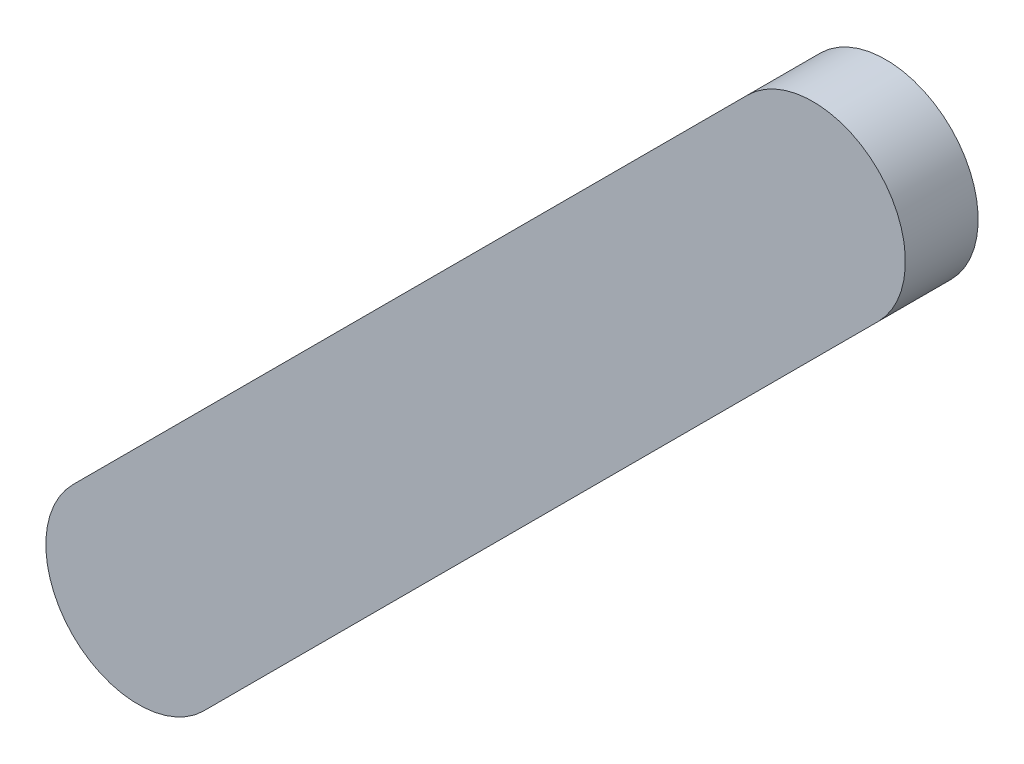
ISO-10303-21;
HEADER;
FILE_DESCRIPTION(('STEP AP214'),'2;1');
FILE_NAME('part.step','',(''),(''),'','','');
FILE_SCHEMA(('AUTOMOTIVE_DESIGN { 1 0 10303 214 1 1 1 1 }'));
ENDSEC;
DATA;
#1=APPLICATION_CONTEXT('core data for automotive mechanical design processes');
#2=APPLICATION_PROTOCOL_DEFINITION('international standard','automotive_design',2000,#1);
#3=PRODUCT_CONTEXT('',#1,'mechanical');
#4=PRODUCT('Part','Part','',(#3));
#5=PRODUCT_RELATED_PRODUCT_CATEGORY('part','',(#4));
#6=PRODUCT_DEFINITION_FORMATION('','',#4);
#7=PRODUCT_DEFINITION_CONTEXT('part definition',#1,'design');
#8=PRODUCT_DEFINITION('design','',#6,#7);
#9=PRODUCT_DEFINITION_SHAPE('','',#8);
#10=(LENGTH_UNIT() NAMED_UNIT(*) SI_UNIT(.MILLI.,.METRE.));
#11=(NAMED_UNIT(*) PLANE_ANGLE_UNIT() SI_UNIT($,.RADIAN.));
#12=(NAMED_UNIT(*) SI_UNIT($,.STERADIAN.) SOLID_ANGLE_UNIT());
#13=UNCERTAINTY_MEASURE_WITH_UNIT(LENGTH_MEASURE(1.E-05),#10,'distance_accuracy_value','');
#14=(GEOMETRIC_REPRESENTATION_CONTEXT(3) GLOBAL_UNCERTAINTY_ASSIGNED_CONTEXT((#13)) GLOBAL_UNIT_ASSIGNED_CONTEXT((#10,
#11,#12)) REPRESENTATION_CONTEXT('',''));
#15=CARTESIAN_POINT('',(0.,0.,0.));
#16=DIRECTION('',(0.,0.,1.));
#17=DIRECTION('',(1.,0.,0.));
#18=AXIS2_PLACEMENT_3D('',#15,#16,#17);
#19=CARTESIAN_POINT('',(107.74860594,119.12419406,0.));
#20=DIRECTION('',(-0.707106781186548,0.707106781186548,0.));
#21=DIRECTION('',(0.707106781186548,0.707106781186548,0.));
#22=AXIS2_PLACEMENT_3D('',#19,#20,#21);
#23=PLANE('',#22);
#24=DIRECTION('',(0.707106781186548,0.707106781186548,0.));
#25=VECTOR('',#24,1.);
#26=CARTESIAN_POINT('',(107.74860594,119.12419406,0.1999996));
#27=LINE('',#26,#25);
#28=CARTESIAN_POINT('',(107.74860594,119.12419406,0.1999996));
#29=VERTEX_POINT('',#28);
#30=CARTESIAN_POINT('',(109.60280594,120.97839406,0.1999996));
#31=VERTEX_POINT('',#30);
#32=EDGE_CURVE('E11',#29,#31,#27,.T.);
#33=ORIENTED_EDGE('',*,*,#32,.F.);
#34=DIRECTION('',(0.,0.,1.));
#35=VECTOR('',#34,1.);
#36=CARTESIAN_POINT('',(107.74860594,119.12419406,0.));
#37=LINE('',#36,#35);
#38=CARTESIAN_POINT('',(107.74860594,119.12419406,0.));
#39=VERTEX_POINT('',#38);
#40=EDGE_CURVE('E24',#39,#29,#37,.T.);
#41=ORIENTED_EDGE('',*,*,#40,.F.);
#42=DIRECTION('',(0.707106781186548,0.707106781186548,0.));
#43=VECTOR('',#42,1.);
#44=CARTESIAN_POINT('',(107.74860594,119.12419406,0.));
#45=LINE('',#44,#43);
#46=CARTESIAN_POINT('',(109.60280594,120.97839406,0.));
#47=VERTEX_POINT('',#46);
#48=EDGE_CURVE('E75',#39,#47,#45,.T.);
#49=ORIENTED_EDGE('',*,*,#48,.T.);
#50=DIRECTION('',(0.,0.,1.));
#51=VECTOR('',#50,1.);
#52=CARTESIAN_POINT('',(109.60280594,120.97839406,0.));
#53=LINE('',#52,#51);
#54=EDGE_CURVE('E37',#47,#31,#53,.T.);
#55=ORIENTED_EDGE('',*,*,#54,.T.);
#56=EDGE_LOOP('',(#33,#41,#49,#55));
#57=FACE_BOUND('',#56,.T.);
#58=ADVANCED_FACE('F17',(#57),#23,.F.);
#59=CARTESIAN_POINT('',(109.4232,121.158,0.));
#60=DIRECTION('',(0.,0.,-1.));
#61=DIRECTION('',(0.707106781186548,-0.707106781186548,0.));
#62=AXIS2_PLACEMENT_3D('',#59,#60,#61);
#63=CYLINDRICAL_SURFACE('',#62,0.254001156230771);
#64=CARTESIAN_POINT('',(109.4232,121.158,0.1999996));
#65=DIRECTION('',(0.,0.,1.));
#66=DIRECTION('',(0.707106781186548,-0.707106781186548,0.));
#67=AXIS2_PLACEMENT_3D('',#64,#65,#66);
#68=CIRCLE('',#67,0.254001156230771);
#69=CARTESIAN_POINT('',(109.24359406,121.33760594,0.1999996));
#70=VERTEX_POINT('',#69);
#71=EDGE_CURVE('E83',#31,#70,#68,.T.);
#72=ORIENTED_EDGE('',*,*,#71,.F.);
#73=ORIENTED_EDGE('',*,*,#54,.F.);
#74=CARTESIAN_POINT('',(109.4232,121.158,0.));
#75=DIRECTION('',(0.,0.,1.));
#76=DIRECTION('',(0.707106781186548,-0.707106781186548,0.));
#77=AXIS2_PLACEMENT_3D('',#74,#75,#76);
#78=CIRCLE('',#77,0.254001156230771);
#79=CARTESIAN_POINT('',(109.24359406,121.33760594,0.));
#80=VERTEX_POINT('',#79);
#81=EDGE_CURVE('E81',#47,#80,#78,.T.);
#82=ORIENTED_EDGE('',*,*,#81,.T.);
#83=DIRECTION('',(0.,0.,1.));
#84=VECTOR('',#83,1.);
#85=CARTESIAN_POINT('',(109.24359406,121.33760594,0.));
#86=LINE('',#85,#84);
#87=EDGE_CURVE('E67',#80,#70,#86,.T.);
#88=ORIENTED_EDGE('',*,*,#87,.T.);
#89=EDGE_LOOP('',(#72,#73,#82,#88));
#90=FACE_BOUND('',#89,.T.);
#91=ADVANCED_FACE('F89',(#90),#63,.T.);
#92=CARTESIAN_POINT('',(109.24359406,121.33760594,0.));
#93=DIRECTION('',(0.707106781186545,-0.70710678118655,0.));
#94=DIRECTION('',(-0.70710678118655,-0.707106781186545,0.));
#95=AXIS2_PLACEMENT_3D('',#92,#93,#94);
#96=PLANE('',#95);
#97=DIRECTION('',(-0.70710678118655,-0.707106781186545,0.));
#98=VECTOR('',#97,1.);
#99=CARTESIAN_POINT('',(109.24359406,121.33760594,0.1999996));
#100=LINE('',#99,#98);
#101=CARTESIAN_POINT('',(107.38939406,119.48340594,0.1999996));
#102=VERTEX_POINT('',#101);
#103=EDGE_CURVE('E71',#70,#102,#100,.T.);
#104=ORIENTED_EDGE('',*,*,#103,.F.);
#105=ORIENTED_EDGE('',*,*,#87,.F.);
#106=DIRECTION('',(-0.70710678118655,-0.707106781186545,0.));
#107=VECTOR('',#106,1.);
#108=CARTESIAN_POINT('',(109.24359406,121.33760594,0.));
#109=LINE('',#108,#107);
#110=CARTESIAN_POINT('',(107.38939406,119.48340594,0.));
#111=VERTEX_POINT('',#110);
#112=EDGE_CURVE('E63',#80,#111,#109,.T.);
#113=ORIENTED_EDGE('',*,*,#112,.T.);
#114=DIRECTION('',(0.,0.,1.));
#115=VECTOR('',#114,1.);
#116=CARTESIAN_POINT('',(107.38939406,119.48340594,0.));
#117=LINE('',#116,#115);
#118=EDGE_CURVE('E53',#111,#102,#117,.T.);
#119=ORIENTED_EDGE('',*,*,#118,.T.);
#120=EDGE_LOOP('',(#104,#105,#113,#119));
#121=FACE_BOUND('',#120,.T.);
#122=ADVANCED_FACE('F66',(#121),#96,.F.);
#123=CARTESIAN_POINT('',(107.569,119.3038,0.));
#124=DIRECTION('',(0.,0.,-1.));
#125=DIRECTION('',(-0.707106781186548,0.707106781186548,0.));
#126=AXIS2_PLACEMENT_3D('',#123,#124,#125);
#127=CYLINDRICAL_SURFACE('',#126,0.254001156230778);
#128=CARTESIAN_POINT('',(107.569,119.3038,0.1999996));
#129=DIRECTION('',(0.,0.,1.));
#130=DIRECTION('',(-0.707106781186548,0.707106781186548,0.));
#131=AXIS2_PLACEMENT_3D('',#128,#129,#130);
#132=CIRCLE('',#131,0.254001156230778);
#133=EDGE_CURVE('E59',#102,#29,#132,.T.);
#134=ORIENTED_EDGE('',*,*,#133,.F.);
#135=ORIENTED_EDGE('',*,*,#118,.F.);
#136=CARTESIAN_POINT('',(107.569,119.3038,0.));
#137=DIRECTION('',(0.,0.,1.));
#138=DIRECTION('',(-0.707106781186548,0.707106781186548,0.));
#139=AXIS2_PLACEMENT_3D('',#136,#137,#138);
#140=CIRCLE('',#139,0.254001156230778);
#141=EDGE_CURVE('E57',#111,#39,#140,.T.);
#142=ORIENTED_EDGE('',*,*,#141,.T.);
#143=ORIENTED_EDGE('',*,*,#40,.T.);
#144=EDGE_LOOP('',(#134,#135,#142,#143));
#145=FACE_BOUND('',#144,.T.);
#146=ADVANCED_FACE('F55',(#145),#127,.T.);
#147=CARTESIAN_POINT('',(107.74860594,119.12419406,0.));
#148=DIRECTION('',(0.,0.,-1.));
#149=DIRECTION('',(-1.,0.,0.));
#150=AXIS2_PLACEMENT_3D('',#147,#148,#149);
#151=PLANE('',#150);
#152=ORIENTED_EDGE('',*,*,#141,.F.);
#153=ORIENTED_EDGE('',*,*,#112,.F.);
#154=ORIENTED_EDGE('',*,*,#81,.F.);
#155=ORIENTED_EDGE('',*,*,#48,.F.);
#156=EDGE_LOOP('',(#152,#153,#154,#155));
#157=FACE_BOUND('',#156,.T.);
#158=ADVANCED_FACE('F74',(#157),#151,.T.);
#159=CARTESIAN_POINT('',(107.74860594,119.12419406,0.1999996));
#160=DIRECTION('',(0.,0.,-1.));
#161=DIRECTION('',(-1.,0.,0.));
#162=AXIS2_PLACEMENT_3D('',#159,#160,#161);
#163=PLANE('',#162);
#164=ORIENTED_EDGE('',*,*,#32,.T.);
#165=ORIENTED_EDGE('',*,*,#71,.T.);
#166=ORIENTED_EDGE('',*,*,#103,.T.);
#167=ORIENTED_EDGE('',*,*,#133,.T.);
#168=EDGE_LOOP('',(#164,#165,#166,#167));
#169=FACE_BOUND('',#168,.T.);
#170=ADVANCED_FACE('F91',(#169),#163,.F.);
#171=CLOSED_SHELL('',(#58,#91,#122,#146,#158,#170));
#172=MANIFOLD_SOLID_BREP('B1',#171);
#173=ADVANCED_BREP_SHAPE_REPRESENTATION('',(#18,#172),#14);
#174=SHAPE_DEFINITION_REPRESENTATION(#9,#173);
ENDSEC;
END-ISO-10303-21;
